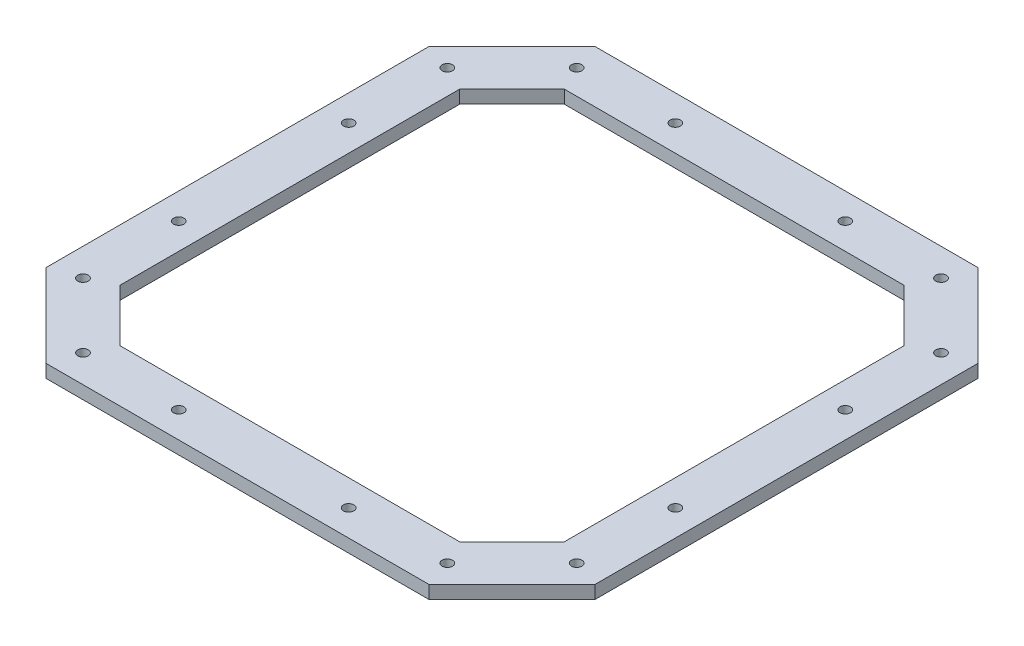
ISO-10303-21;
HEADER;
FILE_DESCRIPTION(('STEP AP214'),'2;1');
FILE_NAME('part.step','',(''),(''),'','','');
FILE_SCHEMA(('AUTOMOTIVE_DESIGN { 1 0 10303 214 1 1 1 1 }'));
ENDSEC;
DATA;
#1=APPLICATION_CONTEXT('core data for automotive mechanical design processes');
#2=APPLICATION_PROTOCOL_DEFINITION('international standard','automotive_design',2000,#1);
#3=PRODUCT_CONTEXT('',#1,'mechanical');
#4=PRODUCT('Part','Part','',(#3));
#5=PRODUCT_RELATED_PRODUCT_CATEGORY('part','',(#4));
#6=PRODUCT_DEFINITION_FORMATION('','',#4);
#7=PRODUCT_DEFINITION_CONTEXT('part definition',#1,'design');
#8=PRODUCT_DEFINITION('design','',#6,#7);
#9=PRODUCT_DEFINITION_SHAPE('','',#8);
#10=(LENGTH_UNIT() NAMED_UNIT(*) SI_UNIT(.MILLI.,.METRE.));
#11=(NAMED_UNIT(*) PLANE_ANGLE_UNIT() SI_UNIT($,.RADIAN.));
#12=(NAMED_UNIT(*) SI_UNIT($,.STERADIAN.) SOLID_ANGLE_UNIT());
#13=UNCERTAINTY_MEASURE_WITH_UNIT(LENGTH_MEASURE(1.E-05),#10,'distance_accuracy_value','');
#14=(GEOMETRIC_REPRESENTATION_CONTEXT(3) GLOBAL_UNCERTAINTY_ASSIGNED_CONTEXT((#13)) GLOBAL_UNIT_ASSIGNED_CONTEXT((#10,
#11,#12)) REPRESENTATION_CONTEXT('',''));
#15=CARTESIAN_POINT('',(0.,0.,0.));
#16=DIRECTION('',(0.,0.,1.));
#17=DIRECTION('',(1.,0.,0.));
#18=AXIS2_PLACEMENT_3D('',#15,#16,#17);
#19=CARTESIAN_POINT('',(0.,5.,0.));
#20=DIRECTION('',(0.,-1.,0.));
#21=DIRECTION('',(0.,0.,-1.));
#22=AXIS2_PLACEMENT_3D('',#19,#20,#21);
#23=PLANE('',#22);
#24=DIRECTION('',(0.707106781186547,0.,-0.707106781186548));
#25=VECTOR('',#24,1.);
#26=CARTESIAN_POINT('',(73.284271247462,5.,105.));
#27=LINE('',#26,#25);
#28=CARTESIAN_POINT('',(73.284271247462,5.,105.));
#29=VERTEX_POINT('',#28);
#30=CARTESIAN_POINT('',(105.,5.,73.2842712474619));
#31=VERTEX_POINT('',#30);
#32=EDGE_CURVE('E220',#29,#31,#27,.T.);
#33=ORIENTED_EDGE('',*,*,#32,.T.);
#34=DIRECTION('',(0.,0.,-1.));
#35=VECTOR('',#34,1.);
#36=CARTESIAN_POINT('',(105.,5.,73.2842712474619));
#37=LINE('',#36,#35);
#38=CARTESIAN_POINT('',(105.,5.,-73.2842712474619));
#39=VERTEX_POINT('',#38);
#40=EDGE_CURVE('E223',#31,#39,#37,.T.);
#41=ORIENTED_EDGE('',*,*,#40,.T.);
#42=DIRECTION('',(-0.707106781186548,0.,-0.707106781186547));
#43=VECTOR('',#42,1.);
#44=CARTESIAN_POINT('',(73.2842712474619,5.,-105.));
#45=LINE('',#44,#43);
#46=CARTESIAN_POINT('',(73.2842712474619,5.,-105.));
#47=VERTEX_POINT('',#46);
#48=EDGE_CURVE('E226',#39,#47,#45,.T.);
#49=ORIENTED_EDGE('',*,*,#48,.T.);
#50=DIRECTION('',(-1.,0.,0.));
#51=VECTOR('',#50,1.);
#52=CARTESIAN_POINT('',(-73.284271247462,5.,-105.));
#53=LINE('',#52,#51);
#54=CARTESIAN_POINT('',(-73.284271247462,5.,-105.));
#55=VERTEX_POINT('',#54);
#56=EDGE_CURVE('E228',#47,#55,#53,.T.);
#57=ORIENTED_EDGE('',*,*,#56,.T.);
#58=DIRECTION('',(-0.707106781186547,0.,0.707106781186548));
#59=VECTOR('',#58,1.);
#60=CARTESIAN_POINT('',(-73.284271247462,5.,-105.));
#61=LINE('',#60,#59);
#62=CARTESIAN_POINT('',(-105.,5.,-73.2842712474619));
#63=VERTEX_POINT('',#62);
#64=EDGE_CURVE('E230',#55,#63,#61,.T.);
#65=ORIENTED_EDGE('',*,*,#64,.T.);
#66=DIRECTION('',(0.,0.,1.));
#67=VECTOR('',#66,1.);
#68=CARTESIAN_POINT('',(-105.,5.,73.2842712474619));
#69=LINE('',#68,#67);
#70=CARTESIAN_POINT('',(-105.,5.,73.2842712474619));
#71=VERTEX_POINT('',#70);
#72=EDGE_CURVE('E232',#63,#71,#69,.T.);
#73=ORIENTED_EDGE('',*,*,#72,.T.);
#74=DIRECTION('',(0.707106781186548,0.,0.707106781186547));
#75=VECTOR('',#74,1.);
#76=CARTESIAN_POINT('',(-73.2842712474619,5.,105.));
#77=LINE('',#76,#75);
#78=CARTESIAN_POINT('',(-73.2842712474619,5.,105.));
#79=VERTEX_POINT('',#78);
#80=EDGE_CURVE('E234',#71,#79,#77,.T.);
#81=ORIENTED_EDGE('',*,*,#80,.T.);
#82=DIRECTION('',(1.,0.,0.));
#83=VECTOR('',#82,1.);
#84=CARTESIAN_POINT('',(-73.2842712474619,5.,105.));
#85=LINE('',#84,#83);
#86=EDGE_CURVE('E236',#79,#29,#85,.T.);
#87=ORIENTED_EDGE('',*,*,#86,.T.);
#88=EDGE_LOOP('',(#33,#41,#49,#57,#65,#73,#81,#87));
#89=FACE_BOUND('',#88,.T.);
#90=DIRECTION('',(0.707106781186548,0.,-0.707106781186548));
#91=VECTOR('',#90,1.);
#92=CARTESIAN_POINT('',(65.0000000000001,5.,84.9999999999999));
#93=LINE('',#92,#91);
#94=CARTESIAN_POINT('',(65.0000000000001,5.,84.9999999999999));
#95=VERTEX_POINT('',#94);
#96=CARTESIAN_POINT('',(85.,5.,65.));
#97=VERTEX_POINT('',#96);
#98=EDGE_CURVE('E152',#95,#97,#93,.T.);
#99=ORIENTED_EDGE('',*,*,#98,.F.);
#100=DIRECTION('',(1.,0.,0.));
#101=VECTOR('',#100,1.);
#102=CARTESIAN_POINT('',(-65.,5.,85.));
#103=LINE('',#102,#101);
#104=CARTESIAN_POINT('',(-65.,5.,85.));
#105=VERTEX_POINT('',#104);
#106=EDGE_CURVE('E187',#105,#95,#103,.T.);
#107=ORIENTED_EDGE('',*,*,#106,.F.);
#108=DIRECTION('',(0.707106781186548,0.,0.707106781186548));
#109=VECTOR('',#108,1.);
#110=CARTESIAN_POINT('',(-65.,5.,85.));
#111=LINE('',#110,#109);
#112=CARTESIAN_POINT('',(-84.9999999999999,5.,65.));
#113=VERTEX_POINT('',#112);
#114=EDGE_CURVE('E185',#113,#105,#111,.T.);
#115=ORIENTED_EDGE('',*,*,#114,.F.);
#116=DIRECTION('',(0.,0.,1.));
#117=VECTOR('',#116,1.);
#118=CARTESIAN_POINT('',(-84.9999999999999,5.,65.));
#119=LINE('',#118,#117);
#120=CARTESIAN_POINT('',(-85.,5.,-65.));
#121=VERTEX_POINT('',#120);
#122=EDGE_CURVE('E183',#121,#113,#119,.T.);
#123=ORIENTED_EDGE('',*,*,#122,.F.);
#124=DIRECTION('',(-0.707106781186547,0.,0.707106781186548));
#125=VECTOR('',#124,1.);
#126=CARTESIAN_POINT('',(-65.0000000000001,5.,-85.));
#127=LINE('',#126,#125);
#128=CARTESIAN_POINT('',(-65.0000000000001,5.,-85.));
#129=VERTEX_POINT('',#128);
#130=EDGE_CURVE('E181',#129,#121,#127,.T.);
#131=ORIENTED_EDGE('',*,*,#130,.F.);
#132=DIRECTION('',(-1.,0.,0.));
#133=VECTOR('',#132,1.);
#134=CARTESIAN_POINT('',(-65.0000000000001,5.,-85.));
#135=LINE('',#134,#133);
#136=CARTESIAN_POINT('',(65.,5.,-85.));
#137=VERTEX_POINT('',#136);
#138=EDGE_CURVE('E176',#137,#129,#135,.T.);
#139=ORIENTED_EDGE('',*,*,#138,.F.);
#140=DIRECTION('',(-0.707106781186548,0.,-0.707106781186548));
#141=VECTOR('',#140,1.);
#142=CARTESIAN_POINT('',(65.,5.,-85.));
#143=LINE('',#142,#141);
#144=CARTESIAN_POINT('',(85.,5.,-65.));
#145=VERTEX_POINT('',#144);
#146=EDGE_CURVE('E174',#145,#137,#143,.T.);
#147=ORIENTED_EDGE('',*,*,#146,.F.);
#148=DIRECTION('',(0.,0.,-1.));
#149=VECTOR('',#148,1.);
#150=CARTESIAN_POINT('',(85.,5.,65.));
#151=LINE('',#150,#149);
#152=EDGE_CURVE('E160',#97,#145,#151,.T.);
#153=ORIENTED_EDGE('',*,*,#152,.F.);
#154=EDGE_LOOP('',(#99,#107,#115,#123,#131,#139,#147,#153));
#155=FACE_BOUND('',#154,.T.);
#156=CARTESIAN_POINT('',(-94.9999999999999,5.,-32.5));
#157=DIRECTION('',(0.,1.,0.));
#158=DIRECTION('',(0.,0.,1.));
#159=AXIS2_PLACEMENT_3D('',#156,#157,#158);
#160=CIRCLE('',#159,2.);
#161=CARTESIAN_POINT('',(-94.9999999999999,5.,-30.5));
#162=VERTEX_POINT('',#161);
#163=EDGE_CURVE('E190',#162,#162,#160,.T.);
#164=ORIENTED_EDGE('',*,*,#163,.F.);
#165=EDGE_LOOP('',(#164));
#166=FACE_BOUND('',#165,.T.);
#167=CARTESIAN_POINT('',(-94.9999999999999,5.,32.5));
#168=DIRECTION('',(0.,1.,0.));
#169=DIRECTION('',(0.,0.,-1.));
#170=AXIS2_PLACEMENT_3D('',#167,#168,#169);
#171=CIRCLE('',#170,2.);
#172=CARTESIAN_POINT('',(-94.9999999999999,5.,30.5));
#173=VERTEX_POINT('',#172);
#174=EDGE_CURVE('E518',#173,#173,#171,.T.);
#175=ORIENTED_EDGE('',*,*,#174,.F.);
#176=EDGE_LOOP('',(#175));
#177=FACE_BOUND('',#176,.T.);
#178=CARTESIAN_POINT('',(32.5,5.,-94.9999999999999));
#179=DIRECTION('',(0.,1.,0.));
#180=DIRECTION('',(0.,0.,1.));
#181=AXIS2_PLACEMENT_3D('',#178,#179,#180);
#182=CIRCLE('',#181,1.99999999999997);
#183=CARTESIAN_POINT('',(32.5,5.,-93.));
#184=VERTEX_POINT('',#183);
#185=EDGE_CURVE('E512',#184,#184,#182,.T.);
#186=ORIENTED_EDGE('',*,*,#185,.F.);
#187=EDGE_LOOP('',(#186));
#188=FACE_BOUND('',#187,.T.);
#189=CARTESIAN_POINT('',(-32.5,5.,-94.9999999999999));
#190=DIRECTION('',(0.,1.,0.));
#191=DIRECTION('',(0.,0.,-1.));
#192=AXIS2_PLACEMENT_3D('',#189,#190,#191);
#193=CIRCLE('',#192,1.99999999999999);
#194=CARTESIAN_POINT('',(-32.5,5.,-96.9999999999999));
#195=VERTEX_POINT('',#194);
#196=EDGE_CURVE('E506',#195,#195,#193,.T.);
#197=ORIENTED_EDGE('',*,*,#196,.F.);
#198=EDGE_LOOP('',(#197));
#199=FACE_BOUND('',#198,.T.);
#200=CARTESIAN_POINT('',(-32.5,5.,94.9999999999999));
#201=DIRECTION('',(0.,1.,0.));
#202=DIRECTION('',(0.,0.,1.));
#203=AXIS2_PLACEMENT_3D('',#200,#201,#202);
#204=CIRCLE('',#203,2.);
#205=CARTESIAN_POINT('',(-32.5,5.,96.9999999999999));
#206=VERTEX_POINT('',#205);
#207=EDGE_CURVE('E500',#206,#206,#204,.T.);
#208=ORIENTED_EDGE('',*,*,#207,.F.);
#209=EDGE_LOOP('',(#208));
#210=FACE_BOUND('',#209,.T.);
#211=CARTESIAN_POINT('',(32.5,5.,94.9999999999999));
#212=DIRECTION('',(0.,1.,0.));
#213=DIRECTION('',(0.,0.,-1.));
#214=AXIS2_PLACEMENT_3D('',#211,#212,#213);
#215=CIRCLE('',#214,1.99999999999998);
#216=CARTESIAN_POINT('',(32.5,5.,92.9999999999999));
#217=VERTEX_POINT('',#216);
#218=EDGE_CURVE('E494',#217,#217,#215,.T.);
#219=ORIENTED_EDGE('',*,*,#218,.F.);
#220=EDGE_LOOP('',(#219));
#221=FACE_BOUND('',#220,.T.);
#222=CARTESIAN_POINT('',(94.9999999999999,5.,32.5));
#223=DIRECTION('',(0.,1.,0.));
#224=DIRECTION('',(0.,0.,1.));
#225=AXIS2_PLACEMENT_3D('',#222,#223,#224);
#226=CIRCLE('',#225,2.);
#227=CARTESIAN_POINT('',(94.9999999999999,5.,34.5));
#228=VERTEX_POINT('',#227);
#229=EDGE_CURVE('E488',#228,#228,#226,.T.);
#230=ORIENTED_EDGE('',*,*,#229,.F.);
#231=EDGE_LOOP('',(#230));
#232=FACE_BOUND('',#231,.T.);
#233=CARTESIAN_POINT('',(94.9999999999999,5.,-32.5));
#234=DIRECTION('',(0.,1.,0.));
#235=DIRECTION('',(0.,0.,-1.));
#236=AXIS2_PLACEMENT_3D('',#233,#234,#235);
#237=CIRCLE('',#236,2.);
#238=CARTESIAN_POINT('',(94.9999999999999,5.,-34.5));
#239=VERTEX_POINT('',#238);
#240=EDGE_CURVE('E482',#239,#239,#237,.T.);
#241=ORIENTED_EDGE('',*,*,#240,.F.);
#242=EDGE_LOOP('',(#241));
#243=FACE_BOUND('',#242,.T.);
#244=CARTESIAN_POINT('',(-94.44543648263,5.,69.6966991411009));
#245=DIRECTION('',(0.,1.,0.));
#246=DIRECTION('',(0.,0.,1.));
#247=AXIS2_PLACEMENT_3D('',#244,#245,#246);
#248=CIRCLE('',#247,2.);
#249=CARTESIAN_POINT('',(-94.44543648263,5.,71.6966991411009));
#250=VERTEX_POINT('',#249);
#251=EDGE_CURVE('E476',#250,#250,#248,.T.);
#252=ORIENTED_EDGE('',*,*,#251,.F.);
#253=EDGE_LOOP('',(#252));
#254=FACE_BOUND('',#253,.T.);
#255=CARTESIAN_POINT('',(-69.6966991411008,5.,94.4454364826301));
#256=DIRECTION('',(0.,1.,0.));
#257=DIRECTION('',(0.,0.,-1.));
#258=AXIS2_PLACEMENT_3D('',#255,#256,#257);
#259=CIRCLE('',#258,2.);
#260=CARTESIAN_POINT('',(-69.6966991411008,5.,92.4454364826301));
#261=VERTEX_POINT('',#260);
#262=EDGE_CURVE('E470',#261,#261,#259,.T.);
#263=ORIENTED_EDGE('',*,*,#262,.F.);
#264=EDGE_LOOP('',(#263));
#265=FACE_BOUND('',#264,.T.);
#266=CARTESIAN_POINT('',(69.6966991411009,5.,94.44543648263));
#267=DIRECTION('',(0.,1.,0.));
#268=DIRECTION('',(0.,0.,1.));
#269=AXIS2_PLACEMENT_3D('',#266,#267,#268);
#270=CIRCLE('',#269,2.);
#271=CARTESIAN_POINT('',(69.6966991411009,5.,96.44543648263));
#272=VERTEX_POINT('',#271);
#273=EDGE_CURVE('E464',#272,#272,#270,.T.);
#274=ORIENTED_EDGE('',*,*,#273,.F.);
#275=EDGE_LOOP('',(#274));
#276=FACE_BOUND('',#275,.T.);
#277=CARTESIAN_POINT('',(94.44543648263,5.,69.6966991411009));
#278=DIRECTION('',(0.,1.,0.));
#279=DIRECTION('',(0.,0.,-1.));
#280=AXIS2_PLACEMENT_3D('',#277,#278,#279);
#281=CIRCLE('',#280,1.99999999999999);
#282=CARTESIAN_POINT('',(94.44543648263,5.,67.6966991411009));
#283=VERTEX_POINT('',#282);
#284=EDGE_CURVE('E458',#283,#283,#281,.T.);
#285=ORIENTED_EDGE('',*,*,#284,.F.);
#286=EDGE_LOOP('',(#285));
#287=FACE_BOUND('',#286,.T.);
#288=CARTESIAN_POINT('',(-94.44543648263,5.,-69.696699141101));
#289=DIRECTION('',(0.,1.,0.));
#290=DIRECTION('',(0.,0.,-1.));
#291=AXIS2_PLACEMENT_3D('',#288,#289,#290);
#292=CIRCLE('',#291,2.);
#293=CARTESIAN_POINT('',(-94.44543648263,5.,-71.696699141101));
#294=VERTEX_POINT('',#293);
#295=EDGE_CURVE('E452',#294,#294,#292,.T.);
#296=ORIENTED_EDGE('',*,*,#295,.F.);
#297=EDGE_LOOP('',(#296));
#298=FACE_BOUND('',#297,.T.);
#299=CARTESIAN_POINT('',(-69.6966991411008,5.,-94.4454364826301));
#300=DIRECTION('',(0.,1.,0.));
#301=DIRECTION('',(0.,0.,1.));
#302=AXIS2_PLACEMENT_3D('',#299,#300,#301);
#303=CIRCLE('',#302,2.);
#304=CARTESIAN_POINT('',(-69.6966991411008,5.,-92.4454364826301));
#305=VERTEX_POINT('',#304);
#306=EDGE_CURVE('E446',#305,#305,#303,.T.);
#307=ORIENTED_EDGE('',*,*,#306,.F.);
#308=EDGE_LOOP('',(#307));
#309=FACE_BOUND('',#308,.T.);
#310=CARTESIAN_POINT('',(69.6966991411008,5.,-94.4454364826301));
#311=DIRECTION('',(0.,1.,0.));
#312=DIRECTION('',(0.,0.,-1.));
#313=AXIS2_PLACEMENT_3D('',#310,#311,#312);
#314=CIRCLE('',#313,2.);
#315=CARTESIAN_POINT('',(69.6966991411008,5.,-96.4454364826301));
#316=VERTEX_POINT('',#315);
#317=EDGE_CURVE('E440',#316,#316,#314,.T.);
#318=ORIENTED_EDGE('',*,*,#317,.F.);
#319=EDGE_LOOP('',(#318));
#320=FACE_BOUND('',#319,.T.);
#321=CARTESIAN_POINT('',(94.4454364826299,5.,-69.6966991411009));
#322=DIRECTION('',(0.,1.,0.));
#323=DIRECTION('',(0.,0.,1.));
#324=AXIS2_PLACEMENT_3D('',#321,#322,#323);
#325=CIRCLE('',#324,1.99999999999999);
#326=CARTESIAN_POINT('',(94.4454364826299,5.,-67.696699141101));
#327=VERTEX_POINT('',#326);
#328=EDGE_CURVE('E431',#327,#327,#325,.T.);
#329=ORIENTED_EDGE('',*,*,#328,.F.);
#330=EDGE_LOOP('',(#329));
#331=FACE_BOUND('',#330,.T.);
#332=ADVANCED_FACE('F39',(#89,#155,#166,#177,#188,#199,#210,#221,#232,#243,#254,#265,#276,#287,
#298,#309,#320,#331),#23,.F.);
#333=CARTESIAN_POINT('',(0.,0.,0.));
#334=DIRECTION('',(0.,-1.,0.));
#335=DIRECTION('',(0.,0.,-1.));
#336=AXIS2_PLACEMENT_3D('',#333,#334,#335);
#337=PLANE('',#336);
#338=CARTESIAN_POINT('',(69.6966991411008,0.,-94.4454364826301));
#339=DIRECTION('',(0.,1.,0.));
#340=DIRECTION('',(0.,0.,-1.));
#341=AXIS2_PLACEMENT_3D('',#338,#339,#340);
#342=CIRCLE('',#341,2.);
#343=CARTESIAN_POINT('',(69.6966991411008,0.,-96.4454364826301));
#344=VERTEX_POINT('',#343);
#345=EDGE_CURVE('E437',#344,#344,#342,.T.);
#346=ORIENTED_EDGE('',*,*,#345,.T.);
#347=EDGE_LOOP('',(#346));
#348=FACE_BOUND('',#347,.T.);
#349=CARTESIAN_POINT('',(-94.44543648263,0.,-69.696699141101));
#350=DIRECTION('',(0.,1.,0.));
#351=DIRECTION('',(0.,0.,-1.));
#352=AXIS2_PLACEMENT_3D('',#349,#350,#351);
#353=CIRCLE('',#352,2.);
#354=CARTESIAN_POINT('',(-94.44543648263,0.,-71.696699141101));
#355=VERTEX_POINT('',#354);
#356=EDGE_CURVE('E449',#355,#355,#353,.T.);
#357=ORIENTED_EDGE('',*,*,#356,.T.);
#358=EDGE_LOOP('',(#357));
#359=FACE_BOUND('',#358,.T.);
#360=CARTESIAN_POINT('',(69.6966991411009,0.,94.44543648263));
#361=DIRECTION('',(0.,1.,0.));
#362=DIRECTION('',(0.,0.,1.));
#363=AXIS2_PLACEMENT_3D('',#360,#361,#362);
#364=CIRCLE('',#363,2.);
#365=CARTESIAN_POINT('',(69.6966991411009,0.,96.44543648263));
#366=VERTEX_POINT('',#365);
#367=EDGE_CURVE('E461',#366,#366,#364,.T.);
#368=ORIENTED_EDGE('',*,*,#367,.T.);
#369=EDGE_LOOP('',(#368));
#370=FACE_BOUND('',#369,.T.);
#371=CARTESIAN_POINT('',(-94.44543648263,0.,69.6966991411009));
#372=DIRECTION('',(0.,1.,0.));
#373=DIRECTION('',(0.,0.,1.));
#374=AXIS2_PLACEMENT_3D('',#371,#372,#373);
#375=CIRCLE('',#374,2.);
#376=CARTESIAN_POINT('',(-94.44543648263,0.,71.6966991411009));
#377=VERTEX_POINT('',#376);
#378=EDGE_CURVE('E473',#377,#377,#375,.T.);
#379=ORIENTED_EDGE('',*,*,#378,.T.);
#380=EDGE_LOOP('',(#379));
#381=FACE_BOUND('',#380,.T.);
#382=CARTESIAN_POINT('',(94.9999999999999,0.,32.5));
#383=DIRECTION('',(0.,1.,0.));
#384=DIRECTION('',(0.,0.,1.));
#385=AXIS2_PLACEMENT_3D('',#382,#383,#384);
#386=CIRCLE('',#385,2.);
#387=CARTESIAN_POINT('',(94.9999999999999,0.,34.5));
#388=VERTEX_POINT('',#387);
#389=EDGE_CURVE('E485',#388,#388,#386,.T.);
#390=ORIENTED_EDGE('',*,*,#389,.T.);
#391=EDGE_LOOP('',(#390));
#392=FACE_BOUND('',#391,.T.);
#393=CARTESIAN_POINT('',(-32.5,0.,94.9999999999999));
#394=DIRECTION('',(0.,1.,0.));
#395=DIRECTION('',(0.,0.,1.));
#396=AXIS2_PLACEMENT_3D('',#393,#394,#395);
#397=CIRCLE('',#396,2.);
#398=CARTESIAN_POINT('',(-32.5,0.,96.9999999999999));
#399=VERTEX_POINT('',#398);
#400=EDGE_CURVE('E497',#399,#399,#397,.T.);
#401=ORIENTED_EDGE('',*,*,#400,.T.);
#402=EDGE_LOOP('',(#401));
#403=FACE_BOUND('',#402,.T.);
#404=CARTESIAN_POINT('',(32.5,0.,-94.9999999999999));
#405=DIRECTION('',(0.,1.,0.));
#406=DIRECTION('',(0.,0.,1.));
#407=AXIS2_PLACEMENT_3D('',#404,#405,#406);
#408=CIRCLE('',#407,1.99999999999997);
#409=CARTESIAN_POINT('',(32.5,0.,-93.));
#410=VERTEX_POINT('',#409);
#411=EDGE_CURVE('E509',#410,#410,#408,.T.);
#412=ORIENTED_EDGE('',*,*,#411,.T.);
#413=EDGE_LOOP('',(#412));
#414=FACE_BOUND('',#413,.T.);
#415=CARTESIAN_POINT('',(-94.9999999999999,0.,-32.5));
#416=DIRECTION('',(0.,1.,0.));
#417=DIRECTION('',(0.,0.,1.));
#418=AXIS2_PLACEMENT_3D('',#415,#416,#417);
#419=CIRCLE('',#418,2.);
#420=CARTESIAN_POINT('',(-94.9999999999999,0.,-30.5));
#421=VERTEX_POINT('',#420);
#422=EDGE_CURVE('E521',#421,#421,#419,.T.);
#423=ORIENTED_EDGE('',*,*,#422,.T.);
#424=EDGE_LOOP('',(#423));
#425=FACE_BOUND('',#424,.T.);
#426=DIRECTION('',(0.707106781186547,0.,-0.707106781186548));
#427=VECTOR('',#426,1.);
#428=CARTESIAN_POINT('',(73.284271247462,0.,105.));
#429=LINE('',#428,#427);
#430=CARTESIAN_POINT('',(73.284271247462,0.,105.));
#431=VERTEX_POINT('',#430);
#432=CARTESIAN_POINT('',(105.,0.,73.2842712474619));
#433=VERTEX_POINT('',#432);
#434=EDGE_CURVE('E168',#431,#433,#429,.T.);
#435=ORIENTED_EDGE('',*,*,#434,.F.);
#436=DIRECTION('',(1.,0.,0.));
#437=VECTOR('',#436,1.);
#438=CARTESIAN_POINT('',(-73.2842712474619,0.,105.));
#439=LINE('',#438,#437);
#440=CARTESIAN_POINT('',(-73.2842712474619,0.,105.));
#441=VERTEX_POINT('',#440);
#442=EDGE_CURVE('E224',#441,#431,#439,.T.);
#443=ORIENTED_EDGE('',*,*,#442,.F.);
#444=DIRECTION('',(0.707106781186548,0.,0.707106781186547));
#445=VECTOR('',#444,1.);
#446=CARTESIAN_POINT('',(-73.2842712474619,0.,105.));
#447=LINE('',#446,#445);
#448=CARTESIAN_POINT('',(-105.,0.,73.2842712474619));
#449=VERTEX_POINT('',#448);
#450=EDGE_CURVE('E251',#449,#441,#447,.T.);
#451=ORIENTED_EDGE('',*,*,#450,.F.);
#452=DIRECTION('',(0.,0.,1.));
#453=VECTOR('',#452,1.);
#454=CARTESIAN_POINT('',(-105.,0.,73.2842712474619));
#455=LINE('',#454,#453);
#456=CARTESIAN_POINT('',(-105.,0.,-73.2842712474619));
#457=VERTEX_POINT('',#456);
#458=EDGE_CURVE('E249',#457,#449,#455,.T.);
#459=ORIENTED_EDGE('',*,*,#458,.F.);
#460=DIRECTION('',(-0.707106781186547,0.,0.707106781186548));
#461=VECTOR('',#460,1.);
#462=CARTESIAN_POINT('',(-73.284271247462,0.,-105.));
#463=LINE('',#462,#461);
#464=CARTESIAN_POINT('',(-73.284271247462,0.,-105.));
#465=VERTEX_POINT('',#464);
#466=EDGE_CURVE('E247',#465,#457,#463,.T.);
#467=ORIENTED_EDGE('',*,*,#466,.F.);
#468=DIRECTION('',(-1.,0.,0.));
#469=VECTOR('',#468,1.);
#470=CARTESIAN_POINT('',(-73.284271247462,0.,-105.));
#471=LINE('',#470,#469);
#472=CARTESIAN_POINT('',(73.2842712474619,0.,-105.));
#473=VERTEX_POINT('',#472);
#474=EDGE_CURVE('E245',#473,#465,#471,.T.);
#475=ORIENTED_EDGE('',*,*,#474,.F.);
#476=DIRECTION('',(-0.707106781186548,0.,-0.707106781186547));
#477=VECTOR('',#476,1.);
#478=CARTESIAN_POINT('',(73.2842712474619,0.,-105.));
#479=LINE('',#478,#477);
#480=CARTESIAN_POINT('',(105.,0.,-73.2842712474619));
#481=VERTEX_POINT('',#480);
#482=EDGE_CURVE('E243',#481,#473,#479,.T.);
#483=ORIENTED_EDGE('',*,*,#482,.F.);
#484=DIRECTION('',(0.,0.,-1.));
#485=VECTOR('',#484,1.);
#486=CARTESIAN_POINT('',(105.,0.,73.2842712474619));
#487=LINE('',#486,#485);
#488=EDGE_CURVE('E241',#433,#481,#487,.T.);
#489=ORIENTED_EDGE('',*,*,#488,.F.);
#490=EDGE_LOOP('',(#435,#443,#451,#459,#467,#475,#483,#489));
#491=FACE_BOUND('',#490,.T.);
#492=DIRECTION('',(1.,0.,0.));
#493=VECTOR('',#492,1.);
#494=CARTESIAN_POINT('',(-65.,0.,85.));
#495=LINE('',#494,#493);
#496=CARTESIAN_POINT('',(-65.,0.,85.));
#497=VERTEX_POINT('',#496);
#498=CARTESIAN_POINT('',(65.0000000000001,0.,84.9999999999999));
#499=VERTEX_POINT('',#498);
#500=EDGE_CURVE('E161',#497,#499,#495,.T.);
#501=ORIENTED_EDGE('',*,*,#500,.T.);
#502=DIRECTION('',(0.707106781186548,0.,-0.707106781186548));
#503=VECTOR('',#502,1.);
#504=CARTESIAN_POINT('',(65.0000000000001,0.,84.9999999999999));
#505=LINE('',#504,#503);
#506=CARTESIAN_POINT('',(85.,0.,65.));
#507=VERTEX_POINT('',#506);
#508=EDGE_CURVE('E62',#499,#507,#505,.T.);
#509=ORIENTED_EDGE('',*,*,#508,.T.);
#510=DIRECTION('',(0.,0.,-1.));
#511=VECTOR('',#510,1.);
#512=CARTESIAN_POINT('',(85.,0.,65.));
#513=LINE('',#512,#511);
#514=CARTESIAN_POINT('',(85.,0.,-65.));
#515=VERTEX_POINT('',#514);
#516=EDGE_CURVE('E167',#507,#515,#513,.T.);
#517=ORIENTED_EDGE('',*,*,#516,.T.);
#518=DIRECTION('',(-0.707106781186548,0.,-0.707106781186548));
#519=VECTOR('',#518,1.);
#520=CARTESIAN_POINT('',(65.,0.,-85.));
#521=LINE('',#520,#519);
#522=CARTESIAN_POINT('',(65.,0.,-85.));
#523=VERTEX_POINT('',#522);
#524=EDGE_CURVE('E192',#515,#523,#521,.T.);
#525=ORIENTED_EDGE('',*,*,#524,.T.);
#526=DIRECTION('',(-1.,0.,0.));
#527=VECTOR('',#526,1.);
#528=CARTESIAN_POINT('',(-65.0000000000001,0.,-85.));
#529=LINE('',#528,#527);
#530=CARTESIAN_POINT('',(-65.0000000000001,0.,-85.));
#531=VERTEX_POINT('',#530);
#532=EDGE_CURVE('E195',#523,#531,#529,.T.);
#533=ORIENTED_EDGE('',*,*,#532,.T.);
#534=DIRECTION('',(-0.707106781186547,0.,0.707106781186548));
#535=VECTOR('',#534,1.);
#536=CARTESIAN_POINT('',(-65.0000000000001,0.,-85.));
#537=LINE('',#536,#535);
#538=CARTESIAN_POINT('',(-85.,0.,-65.));
#539=VERTEX_POINT('',#538);
#540=EDGE_CURVE('E198',#531,#539,#537,.T.);
#541=ORIENTED_EDGE('',*,*,#540,.T.);
#542=DIRECTION('',(0.,0.,1.));
#543=VECTOR('',#542,1.);
#544=CARTESIAN_POINT('',(-84.9999999999999,0.,65.));
#545=LINE('',#544,#543);
#546=CARTESIAN_POINT('',(-84.9999999999999,0.,65.));
#547=VERTEX_POINT('',#546);
#548=EDGE_CURVE('E201',#539,#547,#545,.T.);
#549=ORIENTED_EDGE('',*,*,#548,.T.);
#550=DIRECTION('',(0.707106781186548,0.,0.707106781186548));
#551=VECTOR('',#550,1.);
#552=CARTESIAN_POINT('',(-65.,0.,85.));
#553=LINE('',#552,#551);
#554=EDGE_CURVE('E204',#547,#497,#553,.T.);
#555=ORIENTED_EDGE('',*,*,#554,.T.);
#556=EDGE_LOOP('',(#501,#509,#517,#525,#533,#541,#549,#555));
#557=FACE_BOUND('',#556,.T.);
#558=CARTESIAN_POINT('',(-94.9999999999999,0.,32.5));
#559=DIRECTION('',(0.,1.,0.));
#560=DIRECTION('',(0.,0.,-1.));
#561=AXIS2_PLACEMENT_3D('',#558,#559,#560);
#562=CIRCLE('',#561,2.);
#563=CARTESIAN_POINT('',(-94.9999999999999,0.,30.5));
#564=VERTEX_POINT('',#563);
#565=EDGE_CURVE('E515',#564,#564,#562,.T.);
#566=ORIENTED_EDGE('',*,*,#565,.T.);
#567=EDGE_LOOP('',(#566));
#568=FACE_BOUND('',#567,.T.);
#569=CARTESIAN_POINT('',(-32.5,0.,-94.9999999999999));
#570=DIRECTION('',(0.,1.,0.));
#571=DIRECTION('',(0.,0.,-1.));
#572=AXIS2_PLACEMENT_3D('',#569,#570,#571);
#573=CIRCLE('',#572,1.99999999999999);
#574=CARTESIAN_POINT('',(-32.5,0.,-96.9999999999999));
#575=VERTEX_POINT('',#574);
#576=EDGE_CURVE('E503',#575,#575,#573,.T.);
#577=ORIENTED_EDGE('',*,*,#576,.T.);
#578=EDGE_LOOP('',(#577));
#579=FACE_BOUND('',#578,.T.);
#580=CARTESIAN_POINT('',(32.5,0.,94.9999999999999));
#581=DIRECTION('',(0.,1.,0.));
#582=DIRECTION('',(0.,0.,-1.));
#583=AXIS2_PLACEMENT_3D('',#580,#581,#582);
#584=CIRCLE('',#583,1.99999999999998);
#585=CARTESIAN_POINT('',(32.5,0.,92.9999999999999));
#586=VERTEX_POINT('',#585);
#587=EDGE_CURVE('E491',#586,#586,#584,.T.);
#588=ORIENTED_EDGE('',*,*,#587,.T.);
#589=EDGE_LOOP('',(#588));
#590=FACE_BOUND('',#589,.T.);
#591=CARTESIAN_POINT('',(94.9999999999999,0.,-32.5));
#592=DIRECTION('',(0.,1.,0.));
#593=DIRECTION('',(0.,0.,-1.));
#594=AXIS2_PLACEMENT_3D('',#591,#592,#593);
#595=CIRCLE('',#594,2.);
#596=CARTESIAN_POINT('',(94.9999999999999,0.,-34.5));
#597=VERTEX_POINT('',#596);
#598=EDGE_CURVE('E479',#597,#597,#595,.T.);
#599=ORIENTED_EDGE('',*,*,#598,.T.);
#600=EDGE_LOOP('',(#599));
#601=FACE_BOUND('',#600,.T.);
#602=CARTESIAN_POINT('',(-69.6966991411008,0.,94.4454364826301));
#603=DIRECTION('',(0.,1.,0.));
#604=DIRECTION('',(0.,0.,-1.));
#605=AXIS2_PLACEMENT_3D('',#602,#603,#604);
#606=CIRCLE('',#605,2.);
#607=CARTESIAN_POINT('',(-69.6966991411008,0.,92.4454364826301));
#608=VERTEX_POINT('',#607);
#609=EDGE_CURVE('E467',#608,#608,#606,.T.);
#610=ORIENTED_EDGE('',*,*,#609,.T.);
#611=EDGE_LOOP('',(#610));
#612=FACE_BOUND('',#611,.T.);
#613=CARTESIAN_POINT('',(94.44543648263,0.,69.6966991411009));
#614=DIRECTION('',(0.,1.,0.));
#615=DIRECTION('',(0.,0.,-1.));
#616=AXIS2_PLACEMENT_3D('',#613,#614,#615);
#617=CIRCLE('',#616,1.99999999999999);
#618=CARTESIAN_POINT('',(94.44543648263,0.,67.6966991411009));
#619=VERTEX_POINT('',#618);
#620=EDGE_CURVE('E455',#619,#619,#617,.T.);
#621=ORIENTED_EDGE('',*,*,#620,.T.);
#622=EDGE_LOOP('',(#621));
#623=FACE_BOUND('',#622,.T.);
#624=CARTESIAN_POINT('',(-69.6966991411008,0.,-94.4454364826301));
#625=DIRECTION('',(0.,1.,0.));
#626=DIRECTION('',(0.,0.,1.));
#627=AXIS2_PLACEMENT_3D('',#624,#625,#626);
#628=CIRCLE('',#627,2.);
#629=CARTESIAN_POINT('',(-69.6966991411008,0.,-92.4454364826301));
#630=VERTEX_POINT('',#629);
#631=EDGE_CURVE('E443',#630,#630,#628,.T.);
#632=ORIENTED_EDGE('',*,*,#631,.T.);
#633=EDGE_LOOP('',(#632));
#634=FACE_BOUND('',#633,.T.);
#635=CARTESIAN_POINT('',(94.4454364826299,0.,-69.6966991411009));
#636=DIRECTION('',(0.,1.,0.));
#637=DIRECTION('',(0.,0.,1.));
#638=AXIS2_PLACEMENT_3D('',#635,#636,#637);
#639=CIRCLE('',#638,1.99999999999999);
#640=CARTESIAN_POINT('',(94.4454364826299,0.,-67.696699141101));
#641=VERTEX_POINT('',#640);
#642=EDGE_CURVE('E434',#641,#641,#639,.T.);
#643=ORIENTED_EDGE('',*,*,#642,.T.);
#644=EDGE_LOOP('',(#643));
#645=FACE_BOUND('',#644,.T.);
#646=ADVANCED_FACE('F281',(#348,#359,#370,#381,#392,#403,#414,#425,#491,#557,#568,#579,#590,
#601,#612,#623,#634,#645),#337,.T.);
#647=CARTESIAN_POINT('',(73.284271247462,5.,105.));
#648=DIRECTION('',(-0.707106781186548,0.,-0.707106781186547));
#649=DIRECTION('',(-0.707106781186547,0.,0.707106781186548));
#650=AXIS2_PLACEMENT_3D('',#647,#648,#649);
#651=PLANE('',#650);
#652=ORIENTED_EDGE('',*,*,#434,.T.);
#653=DIRECTION('',(0.,-1.,0.));
#654=VECTOR('',#653,1.);
#655=CARTESIAN_POINT('',(105.,5.,73.2842712474619));
#656=LINE('',#655,#654);
#657=EDGE_CURVE('E11',#31,#433,#656,.T.);
#658=ORIENTED_EDGE('',*,*,#657,.F.);
#659=ORIENTED_EDGE('',*,*,#32,.F.);
#660=DIRECTION('',(0.,-1.,0.));
#661=VECTOR('',#660,1.);
#662=CARTESIAN_POINT('',(73.284271247462,5.,105.));
#663=LINE('',#662,#661);
#664=EDGE_CURVE('E238',#29,#431,#663,.T.);
#665=ORIENTED_EDGE('',*,*,#664,.T.);
#666=EDGE_LOOP('',(#652,#658,#659,#665));
#667=FACE_BOUND('',#666,.T.);
#668=ADVANCED_FACE('F41',(#667),#651,.F.);
#669=CARTESIAN_POINT('',(105.,5.,73.2842712474619));
#670=DIRECTION('',(-1.,0.,0.));
#671=DIRECTION('',(0.,0.,1.));
#672=AXIS2_PLACEMENT_3D('',#669,#670,#671);
#673=PLANE('',#672);
#674=ORIENTED_EDGE('',*,*,#488,.T.);
#675=DIRECTION('',(0.,-1.,0.));
#676=VECTOR('',#675,1.);
#677=CARTESIAN_POINT('',(105.,5.,-73.2842712474619));
#678=LINE('',#677,#676);
#679=EDGE_CURVE('E47',#39,#481,#678,.T.);
#680=ORIENTED_EDGE('',*,*,#679,.F.);
#681=ORIENTED_EDGE('',*,*,#40,.F.);
#682=ORIENTED_EDGE('',*,*,#657,.T.);
#683=EDGE_LOOP('',(#674,#680,#681,#682));
#684=FACE_BOUND('',#683,.T.);
#685=ADVANCED_FACE('F298',(#684),#673,.F.);
#686=CARTESIAN_POINT('',(73.2842712474619,5.,-105.));
#687=DIRECTION('',(-0.707106781186547,0.,0.707106781186548));
#688=DIRECTION('',(0.707106781186548,0.,0.707106781186547));
#689=AXIS2_PLACEMENT_3D('',#686,#687,#688);
#690=PLANE('',#689);
#691=ORIENTED_EDGE('',*,*,#482,.T.);
#692=DIRECTION('',(0.,-1.,0.));
#693=VECTOR('',#692,1.);
#694=CARTESIAN_POINT('',(73.2842712474619,5.,-105.));
#695=LINE('',#694,#693);
#696=EDGE_CURVE('E268',#47,#473,#695,.T.);
#697=ORIENTED_EDGE('',*,*,#696,.F.);
#698=ORIENTED_EDGE('',*,*,#48,.F.);
#699=ORIENTED_EDGE('',*,*,#679,.T.);
#700=EDGE_LOOP('',(#691,#697,#698,#699));
#701=FACE_BOUND('',#700,.T.);
#702=ADVANCED_FACE('F275',(#701),#690,.F.);
#703=CARTESIAN_POINT('',(-73.284271247462,5.,-105.));
#704=DIRECTION('',(0.,0.,1.));
#705=DIRECTION('',(1.,0.,0.));
#706=AXIS2_PLACEMENT_3D('',#703,#704,#705);
#707=PLANE('',#706);
#708=ORIENTED_EDGE('',*,*,#474,.T.);
#709=DIRECTION('',(0.,-1.,0.));
#710=VECTOR('',#709,1.);
#711=CARTESIAN_POINT('',(-73.284271247462,5.,-105.));
#712=LINE('',#711,#710);
#713=EDGE_CURVE('E265',#55,#465,#712,.T.);
#714=ORIENTED_EDGE('',*,*,#713,.F.);
#715=ORIENTED_EDGE('',*,*,#56,.F.);
#716=ORIENTED_EDGE('',*,*,#696,.T.);
#717=EDGE_LOOP('',(#708,#714,#715,#716));
#718=FACE_BOUND('',#717,.T.);
#719=ADVANCED_FACE('F287',(#718),#707,.F.);
#720=CARTESIAN_POINT('',(-73.284271247462,5.,-105.));
#721=DIRECTION('',(0.707106781186548,0.,0.707106781186547));
#722=DIRECTION('',(0.707106781186547,0.,-0.707106781186548));
#723=AXIS2_PLACEMENT_3D('',#720,#721,#722);
#724=PLANE('',#723);
#725=ORIENTED_EDGE('',*,*,#466,.T.);
#726=DIRECTION('',(0.,-1.,0.));
#727=VECTOR('',#726,1.);
#728=CARTESIAN_POINT('',(-105.,5.,-73.2842712474619));
#729=LINE('',#728,#727);
#730=EDGE_CURVE('E262',#63,#457,#729,.T.);
#731=ORIENTED_EDGE('',*,*,#730,.F.);
#732=ORIENTED_EDGE('',*,*,#64,.F.);
#733=ORIENTED_EDGE('',*,*,#713,.T.);
#734=EDGE_LOOP('',(#725,#731,#732,#733));
#735=FACE_BOUND('',#734,.T.);
#736=ADVANCED_FACE('F291',(#735),#724,.F.);
#737=CARTESIAN_POINT('',(-105.,5.,73.2842712474619));
#738=DIRECTION('',(1.,0.,0.));
#739=DIRECTION('',(0.,0.,-1.));
#740=AXIS2_PLACEMENT_3D('',#737,#738,#739);
#741=PLANE('',#740);
#742=ORIENTED_EDGE('',*,*,#458,.T.);
#743=DIRECTION('',(0.,-1.,0.));
#744=VECTOR('',#743,1.);
#745=CARTESIAN_POINT('',(-105.,5.,73.2842712474619));
#746=LINE('',#745,#744);
#747=EDGE_CURVE('E259',#71,#449,#746,.T.);
#748=ORIENTED_EDGE('',*,*,#747,.F.);
#749=ORIENTED_EDGE('',*,*,#72,.F.);
#750=ORIENTED_EDGE('',*,*,#730,.T.);
#751=EDGE_LOOP('',(#742,#748,#749,#750));
#752=FACE_BOUND('',#751,.T.);
#753=ADVANCED_FACE('F311',(#752),#741,.F.);
#754=CARTESIAN_POINT('',(-73.2842712474619,5.,105.));
#755=DIRECTION('',(0.707106781186547,0.,-0.707106781186548));
#756=DIRECTION('',(-0.707106781186548,0.,-0.707106781186547));
#757=AXIS2_PLACEMENT_3D('',#754,#755,#756);
#758=PLANE('',#757);
#759=ORIENTED_EDGE('',*,*,#450,.T.);
#760=DIRECTION('',(0.,-1.,0.));
#761=VECTOR('',#760,1.);
#762=CARTESIAN_POINT('',(-73.2842712474619,5.,105.));
#763=LINE('',#762,#761);
#764=EDGE_CURVE('E256',#79,#441,#763,.T.);
#765=ORIENTED_EDGE('',*,*,#764,.F.);
#766=ORIENTED_EDGE('',*,*,#80,.F.);
#767=ORIENTED_EDGE('',*,*,#747,.T.);
#768=EDGE_LOOP('',(#759,#765,#766,#767));
#769=FACE_BOUND('',#768,.T.);
#770=ADVANCED_FACE('F309',(#769),#758,.F.);
#771=CARTESIAN_POINT('',(-73.2842712474619,5.,105.));
#772=DIRECTION('',(0.,0.,-1.));
#773=DIRECTION('',(-1.,0.,0.));
#774=AXIS2_PLACEMENT_3D('',#771,#772,#773);
#775=PLANE('',#774);
#776=ORIENTED_EDGE('',*,*,#442,.T.);
#777=ORIENTED_EDGE('',*,*,#664,.F.);
#778=ORIENTED_EDGE('',*,*,#86,.F.);
#779=ORIENTED_EDGE('',*,*,#764,.T.);
#780=EDGE_LOOP('',(#776,#777,#778,#779));
#781=FACE_BOUND('',#780,.T.);
#782=ADVANCED_FACE('F304',(#781),#775,.F.);
#783=CARTESIAN_POINT('',(65.0000000000001,5.,84.9999999999999));
#784=DIRECTION('',(-0.707106781186548,0.,-0.707106781186548));
#785=DIRECTION('',(-0.707106781186548,0.,0.707106781186548));
#786=AXIS2_PLACEMENT_3D('',#783,#784,#785);
#787=PLANE('',#786);
#788=ORIENTED_EDGE('',*,*,#508,.F.);
#789=DIRECTION('',(0.,-1.,0.));
#790=VECTOR('',#789,1.);
#791=CARTESIAN_POINT('',(65.0000000000001,5.,84.9999999999999));
#792=LINE('',#791,#790);
#793=EDGE_CURVE('E156',#95,#499,#792,.T.);
#794=ORIENTED_EDGE('',*,*,#793,.F.);
#795=ORIENTED_EDGE('',*,*,#98,.T.);
#796=DIRECTION('',(0.,-1.,0.));
#797=VECTOR('',#796,1.);
#798=CARTESIAN_POINT('',(85.,5.,65.));
#799=LINE('',#798,#797);
#800=EDGE_CURVE('E155',#97,#507,#799,.T.);
#801=ORIENTED_EDGE('',*,*,#800,.T.);
#802=EDGE_LOOP('',(#788,#794,#795,#801));
#803=FACE_BOUND('',#802,.T.);
#804=ADVANCED_FACE('F154',(#803),#787,.T.);
#805=CARTESIAN_POINT('',(85.,5.,65.));
#806=DIRECTION('',(-1.,0.,0.));
#807=DIRECTION('',(0.,0.,1.));
#808=AXIS2_PLACEMENT_3D('',#805,#806,#807);
#809=PLANE('',#808);
#810=ORIENTED_EDGE('',*,*,#516,.F.);
#811=ORIENTED_EDGE('',*,*,#800,.F.);
#812=ORIENTED_EDGE('',*,*,#152,.T.);
#813=DIRECTION('',(0.,-1.,0.));
#814=VECTOR('',#813,1.);
#815=CARTESIAN_POINT('',(85.,5.,-65.));
#816=LINE('',#815,#814);
#817=EDGE_CURVE('E169',#145,#515,#816,.T.);
#818=ORIENTED_EDGE('',*,*,#817,.T.);
#819=EDGE_LOOP('',(#810,#811,#812,#818));
#820=FACE_BOUND('',#819,.T.);
#821=ADVANCED_FACE('F164',(#820),#809,.T.);
#822=CARTESIAN_POINT('',(65.,5.,-85.));
#823=DIRECTION('',(-0.707106781186548,0.,0.707106781186548));
#824=DIRECTION('',(0.707106781186548,0.,0.707106781186548));
#825=AXIS2_PLACEMENT_3D('',#822,#823,#824);
#826=PLANE('',#825);
#827=ORIENTED_EDGE('',*,*,#524,.F.);
#828=ORIENTED_EDGE('',*,*,#817,.F.);
#829=ORIENTED_EDGE('',*,*,#146,.T.);
#830=DIRECTION('',(0.,-1.,0.));
#831=VECTOR('',#830,1.);
#832=CARTESIAN_POINT('',(65.,5.,-85.));
#833=LINE('',#832,#831);
#834=EDGE_CURVE('E217',#137,#523,#833,.T.);
#835=ORIENTED_EDGE('',*,*,#834,.T.);
#836=EDGE_LOOP('',(#827,#828,#829,#835));
#837=FACE_BOUND('',#836,.T.);
#838=ADVANCED_FACE('F337',(#837),#826,.T.);
#839=CARTESIAN_POINT('',(-65.0000000000001,5.,-85.));
#840=DIRECTION('',(0.,0.,1.));
#841=DIRECTION('',(1.,0.,0.));
#842=AXIS2_PLACEMENT_3D('',#839,#840,#841);
#843=PLANE('',#842);
#844=ORIENTED_EDGE('',*,*,#532,.F.);
#845=ORIENTED_EDGE('',*,*,#834,.F.);
#846=ORIENTED_EDGE('',*,*,#138,.T.);
#847=DIRECTION('',(0.,-1.,0.));
#848=VECTOR('',#847,1.);
#849=CARTESIAN_POINT('',(-65.0000000000001,5.,-85.));
#850=LINE('',#849,#848);
#851=EDGE_CURVE('E215',#129,#531,#850,.T.);
#852=ORIENTED_EDGE('',*,*,#851,.T.);
#853=EDGE_LOOP('',(#844,#845,#846,#852));
#854=FACE_BOUND('',#853,.T.);
#855=ADVANCED_FACE('F341',(#854),#843,.T.);
#856=CARTESIAN_POINT('',(-65.0000000000001,5.,-85.));
#857=DIRECTION('',(0.707106781186548,0.,0.707106781186547));
#858=DIRECTION('',(0.707106781186547,0.,-0.707106781186548));
#859=AXIS2_PLACEMENT_3D('',#856,#857,#858);
#860=PLANE('',#859);
#861=ORIENTED_EDGE('',*,*,#540,.F.);
#862=ORIENTED_EDGE('',*,*,#851,.F.);
#863=ORIENTED_EDGE('',*,*,#130,.T.);
#864=DIRECTION('',(0.,-1.,0.));
#865=VECTOR('',#864,1.);
#866=CARTESIAN_POINT('',(-85.,5.,-65.));
#867=LINE('',#866,#865);
#868=EDGE_CURVE('E213',#121,#539,#867,.T.);
#869=ORIENTED_EDGE('',*,*,#868,.T.);
#870=EDGE_LOOP('',(#861,#862,#863,#869));
#871=FACE_BOUND('',#870,.T.);
#872=ADVANCED_FACE('F347',(#871),#860,.T.);
#873=CARTESIAN_POINT('',(-84.9999999999999,5.,65.));
#874=DIRECTION('',(1.,0.,0.));
#875=DIRECTION('',(0.,0.,-1.));
#876=AXIS2_PLACEMENT_3D('',#873,#874,#875);
#877=PLANE('',#876);
#878=ORIENTED_EDGE('',*,*,#548,.F.);
#879=ORIENTED_EDGE('',*,*,#868,.F.);
#880=ORIENTED_EDGE('',*,*,#122,.T.);
#881=DIRECTION('',(0.,-1.,0.));
#882=VECTOR('',#881,1.);
#883=CARTESIAN_POINT('',(-84.9999999999999,5.,65.));
#884=LINE('',#883,#882);
#885=EDGE_CURVE('E211',#113,#547,#884,.T.);
#886=ORIENTED_EDGE('',*,*,#885,.T.);
#887=EDGE_LOOP('',(#878,#879,#880,#886));
#888=FACE_BOUND('',#887,.T.);
#889=ADVANCED_FACE('F351',(#888),#877,.T.);
#890=CARTESIAN_POINT('',(-65.,5.,85.));
#891=DIRECTION('',(0.707106781186548,0.,-0.707106781186548));
#892=DIRECTION('',(-0.707106781186548,0.,-0.707106781186548));
#893=AXIS2_PLACEMENT_3D('',#890,#891,#892);
#894=PLANE('',#893);
#895=ORIENTED_EDGE('',*,*,#554,.F.);
#896=ORIENTED_EDGE('',*,*,#885,.F.);
#897=ORIENTED_EDGE('',*,*,#114,.T.);
#898=DIRECTION('',(0.,-1.,0.));
#899=VECTOR('',#898,1.);
#900=CARTESIAN_POINT('',(-65.,5.,85.));
#901=LINE('',#900,#899);
#902=EDGE_CURVE('E54',#105,#497,#901,.T.);
#903=ORIENTED_EDGE('',*,*,#902,.T.);
#904=EDGE_LOOP('',(#895,#896,#897,#903));
#905=FACE_BOUND('',#904,.T.);
#906=ADVANCED_FACE('F355',(#905),#894,.T.);
#907=CARTESIAN_POINT('',(-65.,5.,85.));
#908=DIRECTION('',(0.,0.,-1.));
#909=DIRECTION('',(-1.,0.,0.));
#910=AXIS2_PLACEMENT_3D('',#907,#908,#909);
#911=PLANE('',#910);
#912=ORIENTED_EDGE('',*,*,#500,.F.);
#913=ORIENTED_EDGE('',*,*,#902,.F.);
#914=ORIENTED_EDGE('',*,*,#106,.T.);
#915=ORIENTED_EDGE('',*,*,#793,.T.);
#916=EDGE_LOOP('',(#912,#913,#914,#915));
#917=FACE_BOUND('',#916,.T.);
#918=ADVANCED_FACE('F359',(#917),#911,.T.);
#919=CARTESIAN_POINT('',(-94.9999999999999,5.,-32.5));
#920=DIRECTION('',(0.,-1.,0.));
#921=DIRECTION('',(0.,0.,-1.));
#922=AXIS2_PLACEMENT_3D('',#919,#920,#921);
#923=CYLINDRICAL_SURFACE('',#922,2.);
#924=ORIENTED_EDGE('',*,*,#163,.T.);
#925=EDGE_LOOP('',(#924));
#926=FACE_BOUND('',#925,.T.);
#927=ORIENTED_EDGE('',*,*,#422,.F.);
#928=EDGE_LOOP('',(#927));
#929=FACE_BOUND('',#928,.T.);
#930=ADVANCED_FACE('F363',(#926,#929),#923,.F.);
#931=CARTESIAN_POINT('',(-94.9999999999999,5.,32.5));
#932=DIRECTION('',(0.,-1.,0.));
#933=DIRECTION('',(0.,0.,-1.));
#934=AXIS2_PLACEMENT_3D('',#931,#932,#933);
#935=CYLINDRICAL_SURFACE('',#934,2.);
#936=ORIENTED_EDGE('',*,*,#174,.T.);
#937=EDGE_LOOP('',(#936));
#938=FACE_BOUND('',#937,.T.);
#939=ORIENTED_EDGE('',*,*,#565,.F.);
#940=EDGE_LOOP('',(#939));
#941=FACE_BOUND('',#940,.T.);
#942=ADVANCED_FACE('F366',(#938,#941),#935,.F.);
#943=CARTESIAN_POINT('',(32.5,5.,-94.9999999999999));
#944=DIRECTION('',(0.,-1.,0.));
#945=DIRECTION('',(0.,0.,-1.));
#946=AXIS2_PLACEMENT_3D('',#943,#944,#945);
#947=CYLINDRICAL_SURFACE('',#946,1.99999999999997);
#948=ORIENTED_EDGE('',*,*,#185,.T.);
#949=EDGE_LOOP('',(#948));
#950=FACE_BOUND('',#949,.T.);
#951=ORIENTED_EDGE('',*,*,#411,.F.);
#952=EDGE_LOOP('',(#951));
#953=FACE_BOUND('',#952,.T.);
#954=ADVANCED_FACE('F370',(#950,#953),#947,.F.);
#955=CARTESIAN_POINT('',(-32.5,5.,-94.9999999999999));
#956=DIRECTION('',(0.,-1.,0.));
#957=DIRECTION('',(0.,0.,-1.));
#958=AXIS2_PLACEMENT_3D('',#955,#956,#957);
#959=CYLINDRICAL_SURFACE('',#958,1.99999999999999);
#960=ORIENTED_EDGE('',*,*,#196,.T.);
#961=EDGE_LOOP('',(#960));
#962=FACE_BOUND('',#961,.T.);
#963=ORIENTED_EDGE('',*,*,#576,.F.);
#964=EDGE_LOOP('',(#963));
#965=FACE_BOUND('',#964,.T.);
#966=ADVANCED_FACE('F374',(#962,#965),#959,.F.);
#967=CARTESIAN_POINT('',(-32.5,5.,94.9999999999999));
#968=DIRECTION('',(0.,-1.,0.));
#969=DIRECTION('',(0.,0.,-1.));
#970=AXIS2_PLACEMENT_3D('',#967,#968,#969);
#971=CYLINDRICAL_SURFACE('',#970,2.);
#972=ORIENTED_EDGE('',*,*,#207,.T.);
#973=EDGE_LOOP('',(#972));
#974=FACE_BOUND('',#973,.T.);
#975=ORIENTED_EDGE('',*,*,#400,.F.);
#976=EDGE_LOOP('',(#975));
#977=FACE_BOUND('',#976,.T.);
#978=ADVANCED_FACE('F378',(#974,#977),#971,.F.);
#979=CARTESIAN_POINT('',(32.5,5.,94.9999999999999));
#980=DIRECTION('',(0.,-1.,0.));
#981=DIRECTION('',(0.,0.,-1.));
#982=AXIS2_PLACEMENT_3D('',#979,#980,#981);
#983=CYLINDRICAL_SURFACE('',#982,1.99999999999998);
#984=ORIENTED_EDGE('',*,*,#218,.T.);
#985=EDGE_LOOP('',(#984));
#986=FACE_BOUND('',#985,.T.);
#987=ORIENTED_EDGE('',*,*,#587,.F.);
#988=EDGE_LOOP('',(#987));
#989=FACE_BOUND('',#988,.T.);
#990=ADVANCED_FACE('F382',(#986,#989),#983,.F.);
#991=CARTESIAN_POINT('',(94.9999999999999,5.,32.5));
#992=DIRECTION('',(0.,-1.,0.));
#993=DIRECTION('',(0.,0.,-1.));
#994=AXIS2_PLACEMENT_3D('',#991,#992,#993);
#995=CYLINDRICAL_SURFACE('',#994,2.);
#996=ORIENTED_EDGE('',*,*,#229,.T.);
#997=EDGE_LOOP('',(#996));
#998=FACE_BOUND('',#997,.T.);
#999=ORIENTED_EDGE('',*,*,#389,.F.);
#1000=EDGE_LOOP('',(#999));
#1001=FACE_BOUND('',#1000,.T.);
#1002=ADVANCED_FACE('F386',(#998,#1001),#995,.F.);
#1003=CARTESIAN_POINT('',(94.9999999999999,5.,-32.5));
#1004=DIRECTION('',(0.,-1.,0.));
#1005=DIRECTION('',(0.,0.,-1.));
#1006=AXIS2_PLACEMENT_3D('',#1003,#1004,#1005);
#1007=CYLINDRICAL_SURFACE('',#1006,2.);
#1008=ORIENTED_EDGE('',*,*,#240,.T.);
#1009=EDGE_LOOP('',(#1008));
#1010=FACE_BOUND('',#1009,.T.);
#1011=ORIENTED_EDGE('',*,*,#598,.F.);
#1012=EDGE_LOOP('',(#1011));
#1013=FACE_BOUND('',#1012,.T.);
#1014=ADVANCED_FACE('F390',(#1010,#1013),#1007,.F.);
#1015=CARTESIAN_POINT('',(-94.44543648263,5.,69.6966991411009));
#1016=DIRECTION('',(0.,-1.,0.));
#1017=DIRECTION('',(0.,0.,-1.));
#1018=AXIS2_PLACEMENT_3D('',#1015,#1016,#1017);
#1019=CYLINDRICAL_SURFACE('',#1018,2.);
#1020=ORIENTED_EDGE('',*,*,#251,.T.);
#1021=EDGE_LOOP('',(#1020));
#1022=FACE_BOUND('',#1021,.T.);
#1023=ORIENTED_EDGE('',*,*,#378,.F.);
#1024=EDGE_LOOP('',(#1023));
#1025=FACE_BOUND('',#1024,.T.);
#1026=ADVANCED_FACE('F394',(#1022,#1025),#1019,.F.);
#1027=CARTESIAN_POINT('',(-69.6966991411008,5.,94.4454364826301));
#1028=DIRECTION('',(0.,-1.,0.));
#1029=DIRECTION('',(0.,0.,-1.));
#1030=AXIS2_PLACEMENT_3D('',#1027,#1028,#1029);
#1031=CYLINDRICAL_SURFACE('',#1030,2.);
#1032=ORIENTED_EDGE('',*,*,#262,.T.);
#1033=EDGE_LOOP('',(#1032));
#1034=FACE_BOUND('',#1033,.T.);
#1035=ORIENTED_EDGE('',*,*,#609,.F.);
#1036=EDGE_LOOP('',(#1035));
#1037=FACE_BOUND('',#1036,.T.);
#1038=ADVANCED_FACE('F398',(#1034,#1037),#1031,.F.);
#1039=CARTESIAN_POINT('',(69.6966991411009,5.,94.44543648263));
#1040=DIRECTION('',(0.,-1.,0.));
#1041=DIRECTION('',(0.,0.,-1.));
#1042=AXIS2_PLACEMENT_3D('',#1039,#1040,#1041);
#1043=CYLINDRICAL_SURFACE('',#1042,2.);
#1044=ORIENTED_EDGE('',*,*,#273,.T.);
#1045=EDGE_LOOP('',(#1044));
#1046=FACE_BOUND('',#1045,.T.);
#1047=ORIENTED_EDGE('',*,*,#367,.F.);
#1048=EDGE_LOOP('',(#1047));
#1049=FACE_BOUND('',#1048,.T.);
#1050=ADVANCED_FACE('F402',(#1046,#1049),#1043,.F.);
#1051=CARTESIAN_POINT('',(94.44543648263,5.,69.6966991411009));
#1052=DIRECTION('',(0.,-1.,0.));
#1053=DIRECTION('',(0.,0.,-1.));
#1054=AXIS2_PLACEMENT_3D('',#1051,#1052,#1053);
#1055=CYLINDRICAL_SURFACE('',#1054,1.99999999999999);
#1056=ORIENTED_EDGE('',*,*,#284,.T.);
#1057=EDGE_LOOP('',(#1056));
#1058=FACE_BOUND('',#1057,.T.);
#1059=ORIENTED_EDGE('',*,*,#620,.F.);
#1060=EDGE_LOOP('',(#1059));
#1061=FACE_BOUND('',#1060,.T.);
#1062=ADVANCED_FACE('F406',(#1058,#1061),#1055,.F.);
#1063=CARTESIAN_POINT('',(-94.44543648263,5.,-69.696699141101));
#1064=DIRECTION('',(0.,-1.,0.));
#1065=DIRECTION('',(0.,0.,-1.));
#1066=AXIS2_PLACEMENT_3D('',#1063,#1064,#1065);
#1067=CYLINDRICAL_SURFACE('',#1066,2.);
#1068=ORIENTED_EDGE('',*,*,#295,.T.);
#1069=EDGE_LOOP('',(#1068));
#1070=FACE_BOUND('',#1069,.T.);
#1071=ORIENTED_EDGE('',*,*,#356,.F.);
#1072=EDGE_LOOP('',(#1071));
#1073=FACE_BOUND('',#1072,.T.);
#1074=ADVANCED_FACE('F410',(#1070,#1073),#1067,.F.);
#1075=CARTESIAN_POINT('',(-69.6966991411008,5.,-94.4454364826301));
#1076=DIRECTION('',(0.,-1.,0.));
#1077=DIRECTION('',(0.,0.,-1.));
#1078=AXIS2_PLACEMENT_3D('',#1075,#1076,#1077);
#1079=CYLINDRICAL_SURFACE('',#1078,2.);
#1080=ORIENTED_EDGE('',*,*,#306,.T.);
#1081=EDGE_LOOP('',(#1080));
#1082=FACE_BOUND('',#1081,.T.);
#1083=ORIENTED_EDGE('',*,*,#631,.F.);
#1084=EDGE_LOOP('',(#1083));
#1085=FACE_BOUND('',#1084,.T.);
#1086=ADVANCED_FACE('F414',(#1082,#1085),#1079,.F.);
#1087=CARTESIAN_POINT('',(69.6966991411008,5.,-94.4454364826301));
#1088=DIRECTION('',(0.,-1.,0.));
#1089=DIRECTION('',(0.,0.,-1.));
#1090=AXIS2_PLACEMENT_3D('',#1087,#1088,#1089);
#1091=CYLINDRICAL_SURFACE('',#1090,2.);
#1092=ORIENTED_EDGE('',*,*,#317,.T.);
#1093=EDGE_LOOP('',(#1092));
#1094=FACE_BOUND('',#1093,.T.);
#1095=ORIENTED_EDGE('',*,*,#345,.F.);
#1096=EDGE_LOOP('',(#1095));
#1097=FACE_BOUND('',#1096,.T.);
#1098=ADVANCED_FACE('F418',(#1094,#1097),#1091,.F.);
#1099=CARTESIAN_POINT('',(94.4454364826299,5.,-69.6966991411009));
#1100=DIRECTION('',(0.,-1.,0.));
#1101=DIRECTION('',(0.,0.,-1.));
#1102=AXIS2_PLACEMENT_3D('',#1099,#1100,#1101);
#1103=CYLINDRICAL_SURFACE('',#1102,1.99999999999999);
#1104=ORIENTED_EDGE('',*,*,#328,.T.);
#1105=EDGE_LOOP('',(#1104));
#1106=FACE_BOUND('',#1105,.T.);
#1107=ORIENTED_EDGE('',*,*,#642,.F.);
#1108=EDGE_LOOP('',(#1107));
#1109=FACE_BOUND('',#1108,.T.);
#1110=ADVANCED_FACE('F422',(#1106,#1109),#1103,.F.);
#1111=CLOSED_SHELL('',(#332,#646,#668,#685,#702,#719,#736,#753,#770,#782,#804,#821,#838,#855,
#872,#889,#906,#918,#930,#942,#954,#966,#978,#990,#1002,#1014,#1026,#1038,#1050,#1062,#1074,
#1086,#1098,#1110));
#1112=MANIFOLD_SOLID_BREP('B2',#1111);
#1113=ADVANCED_BREP_SHAPE_REPRESENTATION('',(#18,#1112),#14);
#1114=SHAPE_DEFINITION_REPRESENTATION(#9,#1113);
ENDSEC;
END-ISO-10303-21;
